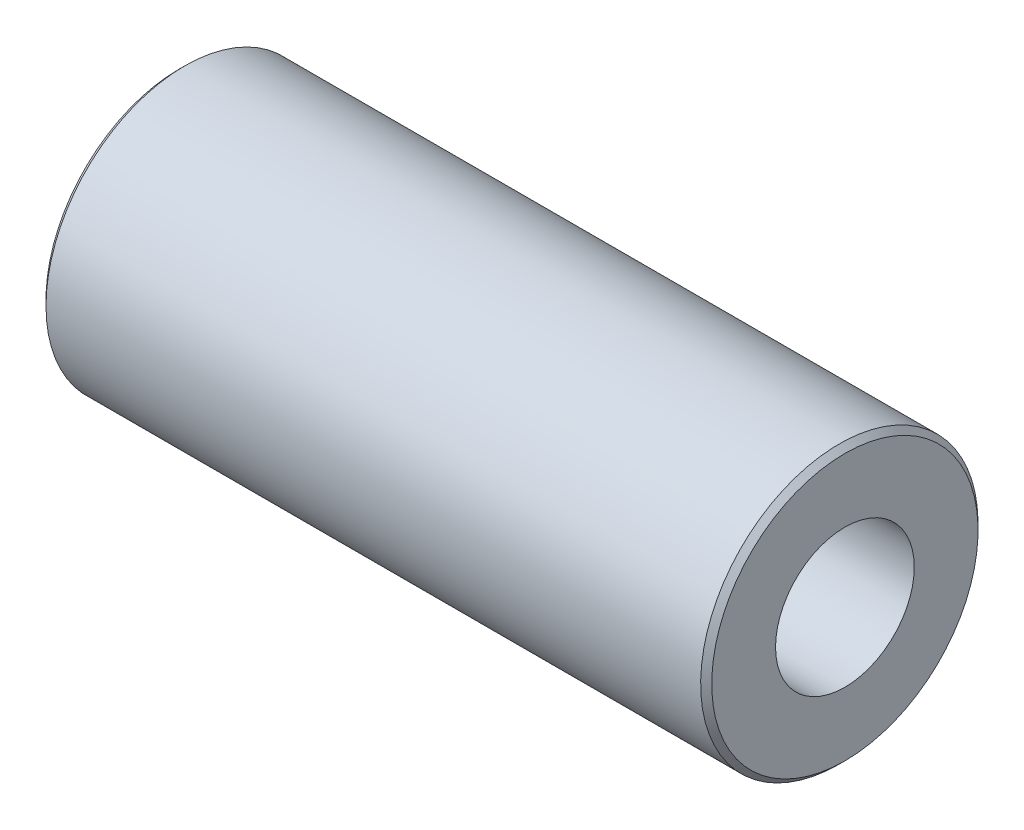
ISO-10303-21;
HEADER;
FILE_DESCRIPTION(('STEP AP214'),'2;1');
FILE_NAME('part.step','',(''),(''),'','','');
FILE_SCHEMA(('AUTOMOTIVE_DESIGN { 1 0 10303 214 1 1 1 1 }'));
ENDSEC;
DATA;
#1=APPLICATION_CONTEXT('core data for automotive mechanical design processes');
#2=APPLICATION_PROTOCOL_DEFINITION('international standard','automotive_design',2000,#1);
#3=PRODUCT_CONTEXT('',#1,'mechanical');
#4=PRODUCT('Part','Part','',(#3));
#5=PRODUCT_RELATED_PRODUCT_CATEGORY('part','',(#4));
#6=PRODUCT_DEFINITION_FORMATION('','',#4);
#7=PRODUCT_DEFINITION_CONTEXT('part definition',#1,'design');
#8=PRODUCT_DEFINITION('design','',#6,#7);
#9=PRODUCT_DEFINITION_SHAPE('','',#8);
#10=(LENGTH_UNIT() NAMED_UNIT(*) SI_UNIT(.MILLI.,.METRE.));
#11=(NAMED_UNIT(*) PLANE_ANGLE_UNIT() SI_UNIT($,.RADIAN.));
#12=(NAMED_UNIT(*) SI_UNIT($,.STERADIAN.) SOLID_ANGLE_UNIT());
#13=UNCERTAINTY_MEASURE_WITH_UNIT(LENGTH_MEASURE(1.E-05),#10,'distance_accuracy_value','');
#14=(GEOMETRIC_REPRESENTATION_CONTEXT(3) GLOBAL_UNCERTAINTY_ASSIGNED_CONTEXT((#13)) GLOBAL_UNIT_ASSIGNED_CONTEXT((#10,
#11,#12)) REPRESENTATION_CONTEXT('',''));
#15=CARTESIAN_POINT('',(0.,0.,0.));
#16=DIRECTION('',(0.,0.,1.));
#17=DIRECTION('',(1.,0.,0.));
#18=AXIS2_PLACEMENT_3D('',#15,#16,#17);
#19=CARTESIAN_POINT('',(6.,0.,0.));
#20=DIRECTION('',(-1.,0.,0.));
#21=DIRECTION('',(0.,-1.,0.));
#22=AXIS2_PLACEMENT_3D('',#19,#20,#21);
#23=PLANE('',#22);
#24=CARTESIAN_POINT('',(6.,0.,0.));
#25=DIRECTION('',(-1.,0.,0.));
#26=DIRECTION('',(0.,-1.,0.));
#27=AXIS2_PLACEMENT_3D('',#24,#25,#26);
#28=CIRCLE('',#27,2.4);
#29=CARTESIAN_POINT('',(6.,-2.4,0.));
#30=VERTEX_POINT('',#29);
#31=EDGE_CURVE('E53',#30,#30,#28,.F.);
#32=ORIENTED_EDGE('',*,*,#31,.T.);
#33=EDGE_LOOP('',(#32));
#34=FACE_BOUND('',#33,.T.);
#35=CARTESIAN_POINT('',(6.,0.,0.));
#36=DIRECTION('',(1.,0.,0.));
#37=DIRECTION('',(0.,0.,-1.));
#38=AXIS2_PLACEMENT_3D('',#35,#36,#37);
#39=CIRCLE('',#38,1.25);
#40=CARTESIAN_POINT('',(6.,0.,-1.25));
#41=VERTEX_POINT('',#40);
#42=EDGE_CURVE('E69',#41,#41,#39,.T.);
#43=ORIENTED_EDGE('',*,*,#42,.F.);
#44=EDGE_LOOP('',(#43));
#45=FACE_BOUND('',#44,.T.);
#46=ADVANCED_FACE('F45',(#34,#45),#23,.F.);
#47=CARTESIAN_POINT('',(-6.,0.,0.));
#48=DIRECTION('',(-1.,0.,0.));
#49=DIRECTION('',(0.,-1.,0.));
#50=AXIS2_PLACEMENT_3D('',#47,#48,#49);
#51=CYLINDRICAL_SURFACE('',#50,2.5);
#52=CARTESIAN_POINT('',(5.9,0.,0.));
#53=DIRECTION('',(-1.,0.,0.));
#54=DIRECTION('',(0.,-1.,0.));
#55=AXIS2_PLACEMENT_3D('',#52,#53,#54);
#56=CIRCLE('',#55,2.5);
#57=CARTESIAN_POINT('',(5.9,-2.5,0.));
#58=VERTEX_POINT('',#57);
#59=EDGE_CURVE('E57',#58,#58,#56,.T.);
#60=ORIENTED_EDGE('',*,*,#59,.T.);
#61=EDGE_LOOP('',(#60));
#62=FACE_BOUND('',#61,.T.);
#63=CARTESIAN_POINT('',(-5.9,0.,0.));
#64=DIRECTION('',(1.,0.,0.));
#65=DIRECTION('',(0.,1.,0.));
#66=AXIS2_PLACEMENT_3D('',#63,#64,#65);
#67=CIRCLE('',#66,2.5);
#68=CARTESIAN_POINT('',(-5.9,2.5,0.));
#69=VERTEX_POINT('',#68);
#70=EDGE_CURVE('E61',#69,#69,#67,.T.);
#71=ORIENTED_EDGE('',*,*,#70,.T.);
#72=EDGE_LOOP('',(#71));
#73=FACE_BOUND('',#72,.T.);
#74=ADVANCED_FACE('F76',(#62,#73),#51,.T.);
#75=CARTESIAN_POINT('',(-6.,2.5,0.));
#76=DIRECTION('',(1.,0.,0.));
#77=DIRECTION('',(0.,1.,0.));
#78=AXIS2_PLACEMENT_3D('',#75,#76,#77);
#79=PLANE('',#78);
#80=CARTESIAN_POINT('',(-6.,0.,0.));
#81=DIRECTION('',(1.,0.,0.));
#82=DIRECTION('',(0.,1.,0.));
#83=AXIS2_PLACEMENT_3D('',#80,#81,#82);
#84=CIRCLE('',#83,2.4);
#85=CARTESIAN_POINT('',(-6.,2.4,0.));
#86=VERTEX_POINT('',#85);
#87=EDGE_CURVE('E10',#86,#86,#84,.F.);
#88=ORIENTED_EDGE('',*,*,#87,.T.);
#89=EDGE_LOOP('',(#88));
#90=FACE_BOUND('',#89,.T.);
#91=CARTESIAN_POINT('',(-6.,0.,0.));
#92=DIRECTION('',(-1.,0.,0.));
#93=DIRECTION('',(0.,0.,1.));
#94=AXIS2_PLACEMENT_3D('',#91,#92,#93);
#95=CIRCLE('',#94,1.25);
#96=CARTESIAN_POINT('',(-6.,0.,1.25));
#97=VERTEX_POINT('',#96);
#98=EDGE_CURVE('E66',#97,#97,#95,.T.);
#99=ORIENTED_EDGE('',*,*,#98,.F.);
#100=EDGE_LOOP('',(#99));
#101=FACE_BOUND('',#100,.T.);
#102=ADVANCED_FACE('F81',(#90,#101),#79,.F.);
#103=CARTESIAN_POINT('',(-6.,0.,0.));
#104=DIRECTION('',(-1.,0.,0.));
#105=DIRECTION('',(0.,0.,1.));
#106=AXIS2_PLACEMENT_3D('',#103,#104,#105);
#107=CYLINDRICAL_SURFACE('',#106,1.25);
#108=ORIENTED_EDGE('',*,*,#98,.T.);
#109=EDGE_LOOP('',(#108));
#110=FACE_BOUND('',#109,.T.);
#111=ORIENTED_EDGE('',*,*,#42,.T.);
#112=EDGE_LOOP('',(#111));
#113=FACE_BOUND('',#112,.T.);
#114=ADVANCED_FACE('F73',(#110,#113),#107,.F.);
#115=CARTESIAN_POINT('',(5.9,0.,0.));
#116=DIRECTION('',(-1.,0.,0.));
#117=DIRECTION('',(0.,-1.,0.));
#118=AXIS2_PLACEMENT_3D('',#115,#116,#117);
#119=CONICAL_SURFACE('',#118,2.5,0.785398163397444);
#120=ORIENTED_EDGE('',*,*,#31,.F.);
#121=EDGE_LOOP('',(#120));
#122=FACE_BOUND('',#121,.T.);
#123=ORIENTED_EDGE('',*,*,#59,.F.);
#124=EDGE_LOOP('',(#123));
#125=FACE_BOUND('',#124,.T.);
#126=ADVANCED_FACE('F86',(#122,#125),#119,.T.);
#127=CARTESIAN_POINT('',(-6.,0.,0.));
#128=DIRECTION('',(1.,0.,0.));
#129=DIRECTION('',(0.,1.,0.));
#130=AXIS2_PLACEMENT_3D('',#127,#128,#129);
#131=CONICAL_SURFACE('',#130,2.4,0.78539816339744);
#132=ORIENTED_EDGE('',*,*,#70,.F.);
#133=EDGE_LOOP('',(#132));
#134=FACE_BOUND('',#133,.T.);
#135=ORIENTED_EDGE('',*,*,#87,.F.);
#136=EDGE_LOOP('',(#135));
#137=FACE_BOUND('',#136,.T.);
#138=ADVANCED_FACE('F48',(#134,#137),#131,.T.);
#139=CLOSED_SHELL('',(#46,#74,#102,#114,#126,#138));
#140=MANIFOLD_SOLID_BREP('B2',#139);
#141=ADVANCED_BREP_SHAPE_REPRESENTATION('',(#18,#140),#14);
#142=SHAPE_DEFINITION_REPRESENTATION(#9,#141);
ENDSEC;
END-ISO-10303-21;
